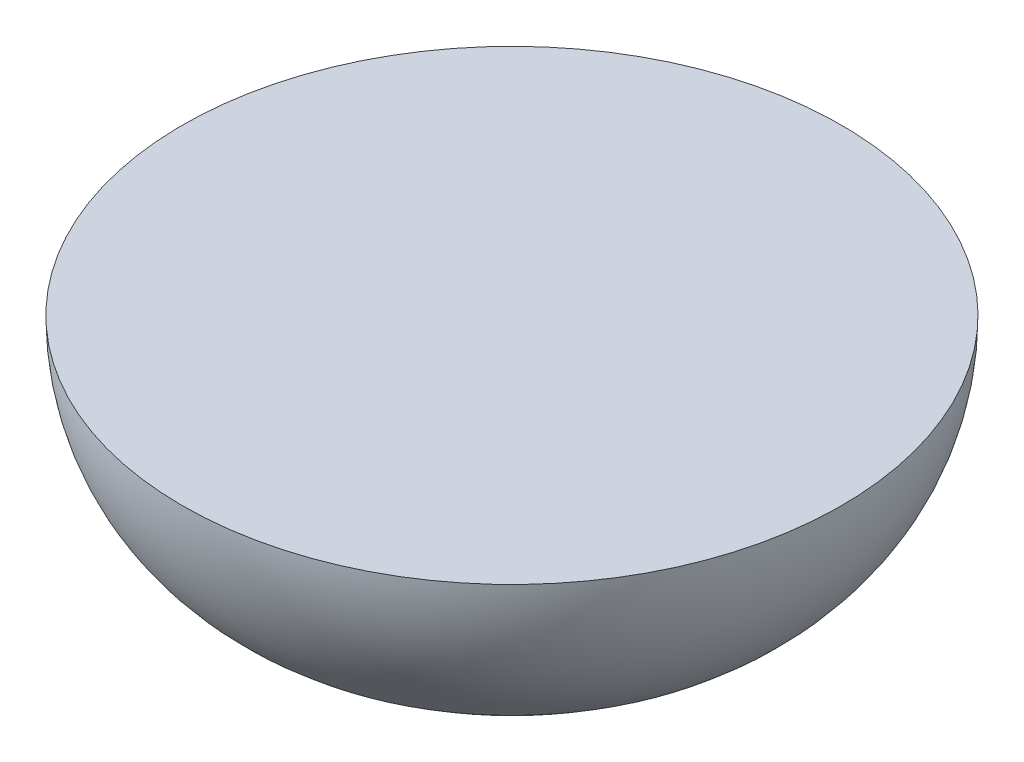
ISO-10303-21;
HEADER;
FILE_DESCRIPTION(('STEP AP214'),'2;1');
FILE_NAME('part.step','',(''),(''),'','','');
FILE_SCHEMA(('AUTOMOTIVE_DESIGN { 1 0 10303 214 1 1 1 1 }'));
ENDSEC;
DATA;
#1=APPLICATION_CONTEXT('core data for automotive mechanical design processes');
#2=APPLICATION_PROTOCOL_DEFINITION('international standard','automotive_design',2000,#1);
#3=PRODUCT_CONTEXT('',#1,'mechanical');
#4=PRODUCT('Part','Part','',(#3));
#5=PRODUCT_RELATED_PRODUCT_CATEGORY('part','',(#4));
#6=PRODUCT_DEFINITION_FORMATION('','',#4);
#7=PRODUCT_DEFINITION_CONTEXT('part definition',#1,'design');
#8=PRODUCT_DEFINITION('design','',#6,#7);
#9=PRODUCT_DEFINITION_SHAPE('','',#8);
#10=(LENGTH_UNIT() NAMED_UNIT(*) SI_UNIT(.MILLI.,.METRE.));
#11=(NAMED_UNIT(*) PLANE_ANGLE_UNIT() SI_UNIT($,.RADIAN.));
#12=(NAMED_UNIT(*) SI_UNIT($,.STERADIAN.) SOLID_ANGLE_UNIT());
#13=UNCERTAINTY_MEASURE_WITH_UNIT(LENGTH_MEASURE(1.E-05),#10,'distance_accuracy_value','');
#14=(GEOMETRIC_REPRESENTATION_CONTEXT(3) GLOBAL_UNCERTAINTY_ASSIGNED_CONTEXT((#13)) GLOBAL_UNIT_ASSIGNED_CONTEXT((#10,
#11,#12)) REPRESENTATION_CONTEXT('',''));
#15=CARTESIAN_POINT('',(0.,0.,0.));
#16=DIRECTION('',(0.,0.,1.));
#17=DIRECTION('',(1.,0.,0.));
#18=AXIS2_PLACEMENT_3D('',#15,#16,#17);
#19=CARTESIAN_POINT('',(0.,10.,0.));
#20=DIRECTION('',(0.,1.,0.));
#21=DIRECTION('',(0.,0.,1.));
#22=AXIS2_PLACEMENT_3D('',#19,#20,#21);
#23=PLANE('',#22);
#24=CARTESIAN_POINT('',(0.,10.,0.));
#25=DIRECTION('',(0.,1.,0.));
#26=DIRECTION('',(0.,0.,1.));
#27=AXIS2_PLACEMENT_3D('',#24,#25,#26);
#28=CIRCLE('',#27,15.);
#29=CARTESIAN_POINT('',(0.,10.,15.));
#30=VERTEX_POINT('',#29);
#31=EDGE_CURVE('E40',#30,#30,#28,.T.);
#32=ORIENTED_EDGE('',*,*,#31,.T.);
#33=EDGE_LOOP('',(#32));
#34=FACE_BOUND('',#33,.T.);
#35=ADVANCED_FACE('F33',(#34),#23,.T.);
#36=CARTESIAN_POINT('',(0.,0.,0.));
#37=DIRECTION('',(0.,1.,0.));
#38=DIRECTION('',(0.,0.,1.));
#39=AXIS2_PLACEMENT_3D('',#36,#37,#38);
#40=PLANE('',#39);
#41=CARTESIAN_POINT('',(0.,0.,0.));
#42=DIRECTION('',(0.,1.,0.));
#43=DIRECTION('',(0.,0.,1.));
#44=AXIS2_PLACEMENT_3D('',#41,#42,#43);
#45=CIRCLE('',#44,5.);
#46=CARTESIAN_POINT('',(0.,0.,5.));
#47=VERTEX_POINT('',#46);
#48=EDGE_CURVE('E10',#47,#47,#45,.F.);
#49=ORIENTED_EDGE('',*,*,#48,.T.);
#50=EDGE_LOOP('',(#49));
#51=FACE_BOUND('',#50,.T.);
#52=CARTESIAN_POINT('',(0.,0.,0.));
#53=DIRECTION('',(0.,-1.,0.));
#54=DIRECTION('',(0.,0.,-1.));
#55=AXIS2_PLACEMENT_3D('',#52,#53,#54);
#56=CIRCLE('',#55,3.9);
#57=CARTESIAN_POINT('',(0.,0.,-3.9));
#58=VERTEX_POINT('',#57);
#59=EDGE_CURVE('E48',#58,#58,#56,.T.);
#60=ORIENTED_EDGE('',*,*,#59,.F.);
#61=EDGE_LOOP('',(#60));
#62=FACE_BOUND('',#61,.T.);
#63=ADVANCED_FACE('F56',(#51,#62),#40,.F.);
#64=CARTESIAN_POINT('',(0.,7.,0.));
#65=DIRECTION('',(0.,-1.,0.));
#66=DIRECTION('',(0.,0.,-1.));
#67=AXIS2_PLACEMENT_3D('',#64,#65,#66);
#68=CYLINDRICAL_SURFACE('',#67,3.9);
#69=CARTESIAN_POINT('',(0.,7.,0.));
#70=DIRECTION('',(0.,-1.,0.));
#71=DIRECTION('',(0.,0.,-1.));
#72=AXIS2_PLACEMENT_3D('',#69,#70,#71);
#73=CIRCLE('',#72,3.9);
#74=CARTESIAN_POINT('',(0.,7.,-3.9));
#75=VERTEX_POINT('',#74);
#76=EDGE_CURVE('E44',#75,#75,#73,.T.);
#77=ORIENTED_EDGE('',*,*,#76,.F.);
#78=EDGE_LOOP('',(#77));
#79=FACE_BOUND('',#78,.T.);
#80=ORIENTED_EDGE('',*,*,#59,.T.);
#81=EDGE_LOOP('',(#80));
#82=FACE_BOUND('',#81,.T.);
#83=ADVANCED_FACE('F54',(#79,#82),#68,.F.);
#84=CARTESIAN_POINT('',(0.,7.,0.));
#85=DIRECTION('',(0.,-1.,0.));
#86=DIRECTION('',(0.,0.,-1.));
#87=AXIS2_PLACEMENT_3D('',#84,#85,#86);
#88=PLANE('',#87);
#89=ORIENTED_EDGE('',*,*,#76,.T.);
#90=EDGE_LOOP('',(#89));
#91=FACE_BOUND('',#90,.T.);
#92=ADVANCED_FACE('F62',(#91),#88,.T.);
#93=CARTESIAN_POINT('',(0.,10.,0.));
#94=DIRECTION('',(0.,1.,0.));
#95=DIRECTION('',(0.,0.,1.));
#96=AXIS2_PLACEMENT_3D('',#93,#94,#95);
#97=DEGENERATE_TOROIDAL_SURFACE('',#96,5.,10.,.T.);
#98=ORIENTED_EDGE('',*,*,#48,.F.);
#99=EDGE_LOOP('',(#98));
#100=FACE_BOUND('',#99,.T.);
#101=ORIENTED_EDGE('',*,*,#31,.F.);
#102=EDGE_LOOP('',(#101));
#103=FACE_BOUND('',#102,.T.);
#104=ADVANCED_FACE('F35',(#100,#103),#97,.T.);
#105=CLOSED_SHELL('',(#35,#63,#83,#92,#104));
#106=MANIFOLD_SOLID_BREP('B2',#105);
#107=ADVANCED_BREP_SHAPE_REPRESENTATION('',(#18,#106),#14);
#108=SHAPE_DEFINITION_REPRESENTATION(#9,#107);
ENDSEC;
END-ISO-10303-21;
